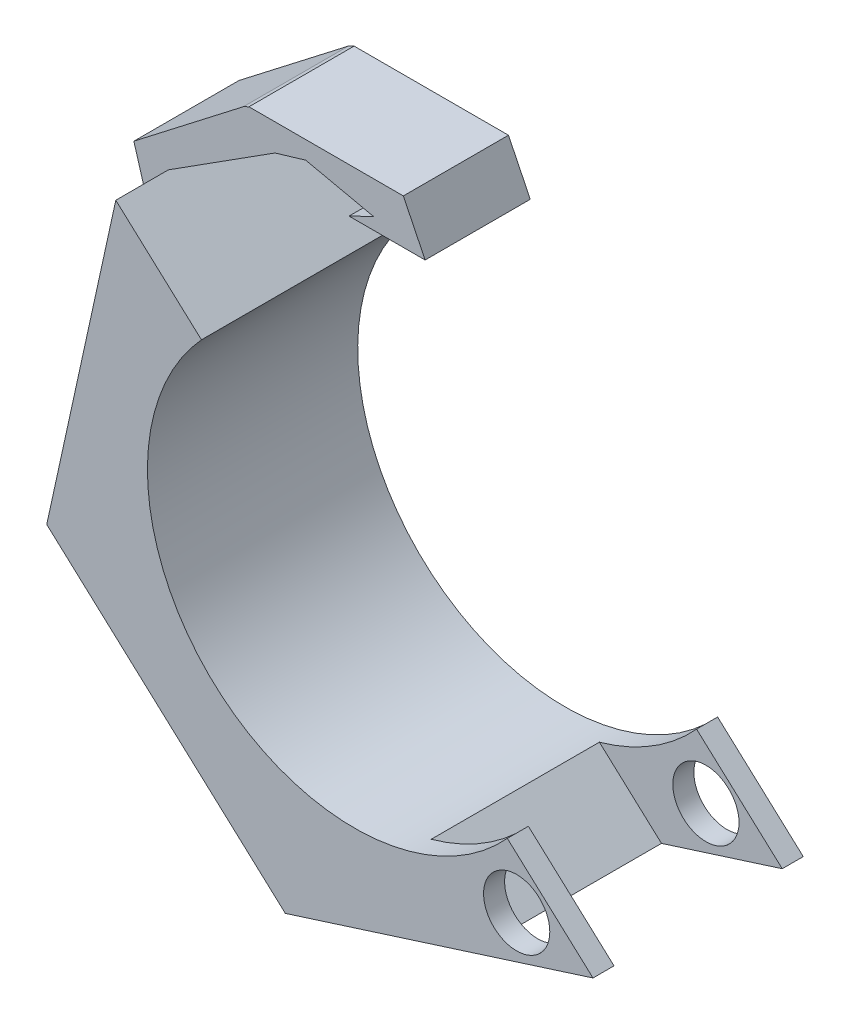
ISO-10303-21;
HEADER;
FILE_DESCRIPTION(('STEP AP214'),'2;1');
FILE_NAME('part.step','',(''),(''),'','','');
FILE_SCHEMA(('AUTOMOTIVE_DESIGN { 1 0 10303 214 1 1 1 1 }'));
ENDSEC;
DATA;
#1=APPLICATION_CONTEXT('core data for automotive mechanical design processes');
#2=APPLICATION_PROTOCOL_DEFINITION('international standard','automotive_design',2000,#1);
#3=PRODUCT_CONTEXT('',#1,'mechanical');
#4=PRODUCT('Part','Part','',(#3));
#5=PRODUCT_RELATED_PRODUCT_CATEGORY('part','',(#4));
#6=PRODUCT_DEFINITION_FORMATION('','',#4);
#7=PRODUCT_DEFINITION_CONTEXT('part definition',#1,'design');
#8=PRODUCT_DEFINITION('design','',#6,#7);
#9=PRODUCT_DEFINITION_SHAPE('','',#8);
#10=(LENGTH_UNIT() NAMED_UNIT(*) SI_UNIT(.MILLI.,.METRE.));
#11=(NAMED_UNIT(*) PLANE_ANGLE_UNIT() SI_UNIT($,.RADIAN.));
#12=(NAMED_UNIT(*) SI_UNIT($,.STERADIAN.) SOLID_ANGLE_UNIT());
#13=UNCERTAINTY_MEASURE_WITH_UNIT(LENGTH_MEASURE(1.E-05),#10,'distance_accuracy_value','');
#14=(GEOMETRIC_REPRESENTATION_CONTEXT(3) GLOBAL_UNCERTAINTY_ASSIGNED_CONTEXT((#13)) GLOBAL_UNIT_ASSIGNED_CONTEXT((#10,
#11,#12)) REPRESENTATION_CONTEXT('',''));
#15=CARTESIAN_POINT('',(0.,0.,0.));
#16=DIRECTION('',(0.,0.,1.));
#17=DIRECTION('',(1.,0.,0.));
#18=AXIS2_PLACEMENT_3D('',#15,#16,#17);
#19=CARTESIAN_POINT('',(-32.9932631854098,7.22458195180058,12.7));
#20=DIRECTION('',(0.976854840079001,-0.213903299213055,0.));
#21=DIRECTION('',(0.213903299213055,0.976854840079001,0.));
#22=AXIS2_PLACEMENT_3D('',#19,#20,#21);
#23=PLANE('',#22);
#24=DIRECTION('',(0.213903299213055,0.976854840079001,0.));
#25=VECTOR('',#24,1.);
#26=CARTESIAN_POINT('',(-28.8221488507552,26.2732513333411,6.35));
#27=LINE('',#26,#25);
#28=CARTESIAN_POINT('',(-30.477907748689,18.7117218973715,6.35));
#29=VERTEX_POINT('',#28);
#30=CARTESIAN_POINT('',(-28.8221488507552,26.2732513333411,6.35));
#31=VERTEX_POINT('',#30);
#32=EDGE_CURVE('E194',#29,#31,#27,.T.);
#33=ORIENTED_EDGE('',*,*,#32,.F.);
#34=DIRECTION('',(0.,0.,-1.));
#35=VECTOR('',#34,1.);
#36=CARTESIAN_POINT('',(-30.477907748689,18.7117218973715,6.35));
#37=LINE('',#36,#35);
#38=CARTESIAN_POINT('',(-30.477907748689,18.7117218973715,-6.35));
#39=VERTEX_POINT('',#38);
#40=EDGE_CURVE('E377',#29,#39,#37,.T.);
#41=ORIENTED_EDGE('',*,*,#40,.T.);
#42=DIRECTION('',(0.213903299213055,0.976854840079001,0.));
#43=VECTOR('',#42,1.);
#44=CARTESIAN_POINT('',(-28.8221488507552,26.2732513333411,-6.35));
#45=LINE('',#44,#43);
#46=CARTESIAN_POINT('',(-28.8221488507552,26.2732513333411,-6.35));
#47=VERTEX_POINT('',#46);
#48=EDGE_CURVE('E409',#39,#47,#45,.T.);
#49=ORIENTED_EDGE('',*,*,#48,.T.);
#50=DIRECTION('',(0.,0.,-1.));
#51=VECTOR('',#50,1.);
#52=CARTESIAN_POINT('',(-28.8221488507552,26.2732513333411,12.7));
#53=LINE('',#52,#51);
#54=CARTESIAN_POINT('',(-28.8221488507552,26.2732513333411,-12.7));
#55=VERTEX_POINT('',#54);
#56=EDGE_CURVE('E214',#47,#55,#53,.T.);
#57=ORIENTED_EDGE('',*,*,#56,.T.);
#58=DIRECTION('',(-0.213903299213055,-0.976854840079001,0.));
#59=VECTOR('',#58,1.);
#60=CARTESIAN_POINT('',(-32.9932631854098,7.22458195180058,-12.7));
#61=LINE('',#60,#59);
#62=CARTESIAN_POINT('',(-37.1643775200644,-11.8240874297399,-12.7));
#63=VERTEX_POINT('',#62);
#64=EDGE_CURVE('E281',#55,#63,#61,.T.);
#65=ORIENTED_EDGE('',*,*,#64,.T.);
#66=DIRECTION('',(0.,0.,-1.));
#67=VECTOR('',#66,1.);
#68=CARTESIAN_POINT('',(-37.1643775200644,-11.8240874297399,12.7));
#69=LINE('',#68,#67);
#70=CARTESIAN_POINT('',(-37.1643775200644,-11.8240874297399,12.7));
#71=VERTEX_POINT('',#70);
#72=EDGE_CURVE('E228',#71,#63,#69,.T.);
#73=ORIENTED_EDGE('',*,*,#72,.F.);
#74=DIRECTION('',(-0.213903299213055,-0.976854840079001,0.));
#75=VECTOR('',#74,1.);
#76=CARTESIAN_POINT('',(-32.9932631854098,7.22458195180058,12.7));
#77=LINE('',#76,#75);
#78=CARTESIAN_POINT('',(-28.8221488507552,26.2732513333411,12.7));
#79=VERTEX_POINT('',#78);
#80=EDGE_CURVE('E219',#79,#71,#77,.T.);
#81=ORIENTED_EDGE('',*,*,#80,.F.);
#82=EDGE_CURVE('E212',#79,#31,#53,.T.);
#83=ORIENTED_EDGE('',*,*,#82,.T.);
#84=EDGE_LOOP('',(#33,#41,#49,#57,#65,#73,#81,#83));
#85=FACE_BOUND('',#84,.T.);
#86=ADVANCED_FACE('F41',(#85),#23,.F.);
#87=CARTESIAN_POINT('',(0.,0.,12.7));
#88=DIRECTION('',(0.,0.,-1.));
#89=DIRECTION('',(-1.,0.,0.));
#90=AXIS2_PLACEMENT_3D('',#87,#88,#89);
#91=CYLINDRICAL_SURFACE('',#90,25.);
#92=DIRECTION('',(0.,0.,-1.));
#93=VECTOR('',#92,1.);
#94=CARTESIAN_POINT('',(6.73418511281736,-24.0759371752443,12.7));
#95=LINE('',#94,#93);
#96=CARTESIAN_POINT('',(6.73418511281735,-24.0759371752443,-10.16));
#97=VERTEX_POINT('',#96);
#98=CARTESIAN_POINT('',(6.73418511281735,-24.0759371752443,10.16));
#99=VERTEX_POINT('',#98);
#100=EDGE_CURVE('E295',#97,#99,#95,.F.);
#101=ORIENTED_EDGE('',*,*,#100,.F.);
#102=CARTESIAN_POINT('',(0.,0.,-10.16));
#103=DIRECTION('',(0.,0.,1.));
#104=DIRECTION('',(1.,0.,0.));
#105=AXIS2_PLACEMENT_3D('',#102,#103,#104);
#106=CIRCLE('',#105,25.);
#107=CARTESIAN_POINT('',(18.4757364427918,-16.8418277777828,-10.16));
#108=VERTEX_POINT('',#107);
#109=EDGE_CURVE('E313',#97,#108,#106,.T.);
#110=ORIENTED_EDGE('',*,*,#109,.T.);
#111=DIRECTION('',(0.,0.,-1.));
#112=VECTOR('',#111,1.);
#113=CARTESIAN_POINT('',(18.4757364427918,-16.8418277777828,12.7));
#114=LINE('',#113,#112);
#115=CARTESIAN_POINT('',(18.4757364427918,-16.8418277777828,-12.7));
#116=VERTEX_POINT('',#115);
#117=EDGE_CURVE('E243',#108,#116,#114,.T.);
#118=ORIENTED_EDGE('',*,*,#117,.T.);
#119=CARTESIAN_POINT('',(0.,0.,-12.7));
#120=DIRECTION('',(0.,0.,1.));
#121=DIRECTION('',(1.,0.,0.));
#122=AXIS2_PLACEMENT_3D('',#119,#120,#121);
#123=CIRCLE('',#122,25.);
#124=CARTESIAN_POINT('',(-18.4757364427918,16.8418277777828,-12.7));
#125=VERTEX_POINT('',#124);
#126=EDGE_CURVE('E292',#125,#116,#123,.T.);
#127=ORIENTED_EDGE('',*,*,#126,.F.);
#128=DIRECTION('',(0.,0.,-1.));
#129=VECTOR('',#128,1.);
#130=CARTESIAN_POINT('',(-18.4757364427918,16.8418277777828,12.7));
#131=LINE('',#130,#129);
#132=CARTESIAN_POINT('',(-18.4757364427918,16.8418277777828,12.7));
#133=VERTEX_POINT('',#132);
#134=EDGE_CURVE('E222',#133,#125,#131,.T.);
#135=ORIENTED_EDGE('',*,*,#134,.F.);
#136=CARTESIAN_POINT('',(0.,0.,12.7));
#137=DIRECTION('',(0.,0.,1.));
#138=DIRECTION('',(1.,0.,0.));
#139=AXIS2_PLACEMENT_3D('',#136,#137,#138);
#140=CIRCLE('',#139,25.);
#141=CARTESIAN_POINT('',(18.4757364427918,-16.8418277777828,12.7));
#142=VERTEX_POINT('',#141);
#143=EDGE_CURVE('E307',#133,#142,#140,.T.);
#144=ORIENTED_EDGE('',*,*,#143,.T.);
#145=CARTESIAN_POINT('',(18.4757364427918,-16.8418277777828,10.16));
#146=VERTEX_POINT('',#145);
#147=EDGE_CURVE('E256',#142,#146,#114,.T.);
#148=ORIENTED_EDGE('',*,*,#147,.T.);
#149=CARTESIAN_POINT('',(0.,0.,10.16));
#150=DIRECTION('',(0.,0.,1.));
#151=DIRECTION('',(1.,0.,0.));
#152=AXIS2_PLACEMENT_3D('',#149,#150,#151);
#153=CIRCLE('',#152,25.);
#154=EDGE_CURVE('E66',#99,#146,#153,.T.);
#155=ORIENTED_EDGE('',*,*,#154,.F.);
#156=EDGE_LOOP('',(#101,#110,#118,#127,#135,#144,#148,#155));
#157=FACE_BOUND('',#156,.T.);
#158=ADVANCED_FACE('F43',(#157),#91,.F.);
#159=CARTESIAN_POINT('',(10.239960090723,-32.1852950482111,12.7));
#160=DIRECTION('',(-0.303181728967691,0.952932756924727,0.));
#161=DIRECTION('',(-0.952932756924728,-0.303181728967691,0.));
#162=AXIS2_PLACEMENT_3D('',#159,#160,#161);
#163=PLANE('',#162);
#164=DIRECTION('',(0.952932756924728,0.303181728967691,0.));
#165=VECTOR('',#164,1.);
#166=CARTESIAN_POINT('',(10.239960090723,-32.1852950482111,-10.16));
#167=LINE('',#166,#165);
#168=CARTESIAN_POINT('',(14.2356770095116,-30.9140318293736,-10.16));
#169=VERTEX_POINT('',#168);
#170=CARTESIAN_POINT('',(28.8221488507552,-26.2732513333411,-10.16));
#171=VERTEX_POINT('',#170);
#172=EDGE_CURVE('E249',#169,#171,#167,.T.);
#173=ORIENTED_EDGE('',*,*,#172,.F.);
#174=DIRECTION('',(0.,0.,1.));
#175=VECTOR('',#174,1.);
#176=CARTESIAN_POINT('',(14.2356770095116,-30.9140318293736,12.7));
#177=LINE('',#176,#175);
#178=CARTESIAN_POINT('',(14.2356770095116,-30.9140318293736,10.16));
#179=VERTEX_POINT('',#178);
#180=EDGE_CURVE('E11',#169,#179,#177,.T.);
#181=ORIENTED_EDGE('',*,*,#180,.T.);
#182=DIRECTION('',(0.952932756924728,0.303181728967691,0.));
#183=VECTOR('',#182,1.);
#184=CARTESIAN_POINT('',(10.239960090723,-32.1852950482111,10.16));
#185=LINE('',#184,#183);
#186=CARTESIAN_POINT('',(28.8221488507552,-26.2732513333411,10.16));
#187=VERTEX_POINT('',#186);
#188=EDGE_CURVE('E320',#179,#187,#185,.T.);
#189=ORIENTED_EDGE('',*,*,#188,.T.);
#190=DIRECTION('',(0.,0.,-1.));
#191=VECTOR('',#190,1.);
#192=CARTESIAN_POINT('',(28.8221488507552,-26.2732513333411,12.7));
#193=LINE('',#192,#191);
#194=CARTESIAN_POINT('',(28.8221488507552,-26.2732513333411,12.7));
#195=VERTEX_POINT('',#194);
#196=EDGE_CURVE('E255',#195,#187,#193,.T.);
#197=ORIENTED_EDGE('',*,*,#196,.F.);
#198=DIRECTION('',(0.952932756924728,0.303181728967691,0.));
#199=VECTOR('',#198,1.);
#200=CARTESIAN_POINT('',(10.239960090723,-32.1852950482111,12.7));
#201=LINE('',#200,#199);
#202=CARTESIAN_POINT('',(-8.34222866930914,-38.097338763081,12.7));
#203=VERTEX_POINT('',#202);
#204=EDGE_CURVE('E296',#203,#195,#201,.T.);
#205=ORIENTED_EDGE('',*,*,#204,.F.);
#206=DIRECTION('',(0.,0.,-1.));
#207=VECTOR('',#206,1.);
#208=CARTESIAN_POINT('',(-8.34222866930914,-38.097338763081,12.7));
#209=LINE('',#208,#207);
#210=CARTESIAN_POINT('',(-8.34222866930914,-38.097338763081,-12.7));
#211=VERTEX_POINT('',#210);
#212=EDGE_CURVE('E261',#203,#211,#209,.T.);
#213=ORIENTED_EDGE('',*,*,#212,.T.);
#214=DIRECTION('',(0.952932756924728,0.303181728967691,0.));
#215=VECTOR('',#214,1.);
#216=CARTESIAN_POINT('',(10.239960090723,-32.1852950482111,-12.7));
#217=LINE('',#216,#215);
#218=CARTESIAN_POINT('',(28.8221488507552,-26.2732513333411,-12.7));
#219=VERTEX_POINT('',#218);
#220=EDGE_CURVE('E252',#211,#219,#217,.T.);
#221=ORIENTED_EDGE('',*,*,#220,.T.);
#222=EDGE_CURVE('E241',#171,#219,#193,.T.);
#223=ORIENTED_EDGE('',*,*,#222,.F.);
#224=EDGE_LOOP('',(#173,#181,#189,#197,#205,#213,#221,#223));
#225=FACE_BOUND('',#224,.T.);
#226=ADVANCED_FACE('F248',(#225),#163,.F.);
#227=CARTESIAN_POINT('',(0.,0.,12.7));
#228=DIRECTION('',(0.67367311111131,0.739029457711672,0.));
#229=DIRECTION('',(-0.739029457711672,0.67367311111131,0.));
#230=AXIS2_PLACEMENT_3D('',#227,#228,#229);
#231=PLANE('',#230);
#232=ORIENTED_EDGE('',*,*,#117,.F.);
#233=DIRECTION('',(0.739029457711672,-0.67367311111131,0.));
#234=VECTOR('',#233,1.);
#235=CARTESIAN_POINT('',(0.,0.,-10.16));
#236=LINE('',#235,#234);
#237=EDGE_CURVE('E51',#108,#171,#236,.T.);
#238=ORIENTED_EDGE('',*,*,#237,.T.);
#239=ORIENTED_EDGE('',*,*,#222,.T.);
#240=DIRECTION('',(0.739029457711672,-0.67367311111131,0.));
#241=VECTOR('',#240,1.);
#242=CARTESIAN_POINT('',(0.,0.,-12.7));
#243=LINE('',#242,#241);
#244=EDGE_CURVE('E286',#116,#219,#243,.T.);
#245=ORIENTED_EDGE('',*,*,#244,.F.);
#246=EDGE_LOOP('',(#232,#238,#239,#245));
#247=FACE_BOUND('',#246,.T.);
#248=ADVANCED_FACE('F239',(#247),#231,.T.);
#249=EDGE_CURVE('E287',#55,#125,#243,.T.);
#250=ORIENTED_EDGE('',*,*,#249,.F.);
#251=ORIENTED_EDGE('',*,*,#56,.F.);
#252=DIRECTION('',(0.,0.,-1.));
#253=VECTOR('',#252,1.);
#254=CARTESIAN_POINT('',(-28.8221488507552,26.2732513333411,6.35));
#255=LINE('',#254,#253);
#256=EDGE_CURVE('E58',#31,#47,#255,.T.);
#257=ORIENTED_EDGE('',*,*,#256,.F.);
#258=ORIENTED_EDGE('',*,*,#82,.F.);
#259=DIRECTION('',(0.739029457711672,-0.67367311111131,0.));
#260=VECTOR('',#259,1.);
#261=CARTESIAN_POINT('',(0.,0.,12.7));
#262=LINE('',#261,#260);
#263=EDGE_CURVE('E304',#79,#133,#262,.T.);
#264=ORIENTED_EDGE('',*,*,#263,.T.);
#265=ORIENTED_EDGE('',*,*,#134,.T.);
#266=EDGE_LOOP('',(#250,#251,#257,#258,#264,#265));
#267=FACE_BOUND('',#266,.T.);
#268=ADVANCED_FACE('F210',(#267),#231,.T.);
#269=CARTESIAN_POINT('',(-22.7533030946868,-24.9607130964105,12.7));
#270=DIRECTION('',(0.67367311111131,0.739029457711672,0.));
#271=DIRECTION('',(-0.739029457711672,0.67367311111131,0.));
#272=AXIS2_PLACEMENT_3D('',#269,#270,#271);
#273=PLANE('',#272);
#274=DIRECTION('',(0.739029457711672,-0.67367311111131,0.));
#275=VECTOR('',#274,1.);
#276=CARTESIAN_POINT('',(-22.7533030946868,-24.9607130964105,-12.7));
#277=LINE('',#276,#275);
#278=EDGE_CURVE('E274',#63,#211,#277,.T.);
#279=ORIENTED_EDGE('',*,*,#278,.T.);
#280=ORIENTED_EDGE('',*,*,#212,.F.);
#281=DIRECTION('',(0.739029457711672,-0.67367311111131,0.));
#282=VECTOR('',#281,1.);
#283=CARTESIAN_POINT('',(-22.7533030946868,-24.9607130964105,12.7));
#284=LINE('',#283,#282);
#285=EDGE_CURVE('E275',#71,#203,#284,.T.);
#286=ORIENTED_EDGE('',*,*,#285,.F.);
#287=ORIENTED_EDGE('',*,*,#72,.T.);
#288=EDGE_LOOP('',(#279,#280,#286,#287));
#289=FACE_BOUND('',#288,.T.);
#290=ADVANCED_FACE('F273',(#289),#273,.F.);
#291=DIRECTION('',(0.739029457711672,-0.67367311111131,0.));
#292=VECTOR('',#291,1.);
#293=CARTESIAN_POINT('',(0.,0.,10.16));
#294=LINE('',#293,#292);
#295=EDGE_CURVE('E226',#146,#187,#294,.T.);
#296=ORIENTED_EDGE('',*,*,#295,.F.);
#297=ORIENTED_EDGE('',*,*,#147,.F.);
#298=EDGE_CURVE('E299',#142,#195,#262,.T.);
#299=ORIENTED_EDGE('',*,*,#298,.T.);
#300=ORIENTED_EDGE('',*,*,#196,.T.);
#301=EDGE_LOOP('',(#296,#297,#299,#300));
#302=FACE_BOUND('',#301,.T.);
#303=ADVANCED_FACE('F499',(#302),#231,.T.);
#304=CARTESIAN_POINT('',(0.,0.,12.7));
#305=DIRECTION('',(0.,0.,1.));
#306=DIRECTION('',(1.,0.,0.));
#307=AXIS2_PLACEMENT_3D('',#304,#305,#306);
#308=PLANE('',#307);
#309=CARTESIAN_POINT('',(19.6038890384153,-24.0503898583383,12.7));
#310=DIRECTION('',(0.,0.,1.));
#311=DIRECTION('',(1.,0.,0.));
#312=AXIS2_PLACEMENT_3D('',#309,#310,#311);
#313=CIRCLE('',#312,4.);
#314=CARTESIAN_POINT('',(23.6038890384153,-24.0503898583383,12.7));
#315=VERTEX_POINT('',#314);
#316=EDGE_CURVE('E329',#315,#315,#313,.T.);
#317=ORIENTED_EDGE('',*,*,#316,.F.);
#318=EDGE_LOOP('',(#317));
#319=FACE_BOUND('',#318,.T.);
#320=ORIENTED_EDGE('',*,*,#143,.F.);
#321=ORIENTED_EDGE('',*,*,#263,.F.);
#322=ORIENTED_EDGE('',*,*,#80,.T.);
#323=ORIENTED_EDGE('',*,*,#285,.T.);
#324=ORIENTED_EDGE('',*,*,#204,.T.);
#325=ORIENTED_EDGE('',*,*,#298,.F.);
#326=EDGE_LOOP('',(#320,#321,#322,#323,#324,#325));
#327=FACE_BOUND('',#326,.T.);
#328=ADVANCED_FACE('F504',(#319,#327),#308,.T.);
#329=CARTESIAN_POINT('',(0.,0.,-12.7));
#330=DIRECTION('',(0.,0.,1.));
#331=DIRECTION('',(1.,0.,0.));
#332=AXIS2_PLACEMENT_3D('',#329,#330,#331);
#333=PLANE('',#332);
#334=CARTESIAN_POINT('',(19.6038890384153,-24.0503898583383,-12.7));
#335=DIRECTION('',(0.,0.,1.));
#336=DIRECTION('',(1.,0.,0.));
#337=AXIS2_PLACEMENT_3D('',#334,#335,#336);
#338=CIRCLE('',#337,4.);
#339=CARTESIAN_POINT('',(23.6038890384153,-24.0503898583383,-12.7));
#340=VERTEX_POINT('',#339);
#341=EDGE_CURVE('E216',#340,#340,#338,.T.);
#342=ORIENTED_EDGE('',*,*,#341,.T.);
#343=EDGE_LOOP('',(#342));
#344=FACE_BOUND('',#343,.T.);
#345=ORIENTED_EDGE('',*,*,#126,.T.);
#346=ORIENTED_EDGE('',*,*,#244,.T.);
#347=ORIENTED_EDGE('',*,*,#220,.F.);
#348=ORIENTED_EDGE('',*,*,#278,.F.);
#349=ORIENTED_EDGE('',*,*,#64,.F.);
#350=ORIENTED_EDGE('',*,*,#249,.T.);
#351=EDGE_LOOP('',(#345,#346,#347,#348,#349,#350));
#352=FACE_BOUND('',#351,.T.);
#353=ADVANCED_FACE('F279',(#344,#352),#333,.F.);
#354=CARTESIAN_POINT('',(3.04575912038011,-20.7136985154716,-10.16));
#355=DIRECTION('',(-0.67367311111131,-0.739029457711672,0.));
#356=DIRECTION('',(0.739029457711673,-0.67367311111131,0.));
#357=AXIS2_PLACEMENT_3D('',#354,#355,#356);
#358=PLANE('',#357);
#359=ORIENTED_EDGE('',*,*,#100,.T.);
#360=DIRECTION('',(0.739029457711673,-0.67367311111131,0.));
#361=VECTOR('',#360,1.);
#362=CARTESIAN_POINT('',(3.04575912038011,-20.7136985154716,10.16));
#363=LINE('',#362,#361);
#364=EDGE_CURVE('E325',#99,#179,#363,.T.);
#365=ORIENTED_EDGE('',*,*,#364,.T.);
#366=ORIENTED_EDGE('',*,*,#180,.F.);
#367=DIRECTION('',(0.739029457711673,-0.67367311111131,0.));
#368=VECTOR('',#367,1.);
#369=CARTESIAN_POINT('',(3.04575912038011,-20.7136985154716,-10.16));
#370=LINE('',#369,#368);
#371=EDGE_CURVE('E324',#97,#169,#370,.T.);
#372=ORIENTED_EDGE('',*,*,#371,.F.);
#373=EDGE_LOOP('',(#359,#365,#366,#372));
#374=FACE_BOUND('',#373,.T.);
#375=ADVANCED_FACE('F508',(#374),#358,.F.);
#376=CARTESIAN_POINT('',(0.,0.,-10.16));
#377=DIRECTION('',(0.,0.,1.));
#378=DIRECTION('',(1.,0.,0.));
#379=AXIS2_PLACEMENT_3D('',#376,#377,#378);
#380=PLANE('',#379);
#381=CARTESIAN_POINT('',(19.6038890384153,-24.0503898583383,-10.16));
#382=DIRECTION('',(0.,0.,1.));
#383=DIRECTION('',(1.,0.,0.));
#384=AXIS2_PLACEMENT_3D('',#381,#382,#383);
#385=CIRCLE('',#384,4.);
#386=CARTESIAN_POINT('',(23.6038890384153,-24.0503898583383,-10.16));
#387=VERTEX_POINT('',#386);
#388=EDGE_CURVE('E336',#387,#387,#385,.T.);
#389=ORIENTED_EDGE('',*,*,#388,.F.);
#390=EDGE_LOOP('',(#389));
#391=FACE_BOUND('',#390,.T.);
#392=ORIENTED_EDGE('',*,*,#371,.T.);
#393=ORIENTED_EDGE('',*,*,#172,.T.);
#394=ORIENTED_EDGE('',*,*,#237,.F.);
#395=ORIENTED_EDGE('',*,*,#109,.F.);
#396=EDGE_LOOP('',(#392,#393,#394,#395));
#397=FACE_BOUND('',#396,.T.);
#398=ADVANCED_FACE('F515',(#391,#397),#380,.T.);
#399=CARTESIAN_POINT('',(0.,0.,10.16));
#400=DIRECTION('',(0.,0.,1.));
#401=DIRECTION('',(1.,0.,0.));
#402=AXIS2_PLACEMENT_3D('',#399,#400,#401);
#403=PLANE('',#402);
#404=CARTESIAN_POINT('',(19.6038890384153,-24.0503898583383,10.16));
#405=DIRECTION('',(0.,0.,1.));
#406=DIRECTION('',(1.,0.,0.));
#407=AXIS2_PLACEMENT_3D('',#404,#405,#406);
#408=CIRCLE('',#407,4.);
#409=CARTESIAN_POINT('',(23.6038890384153,-24.0503898583383,10.16));
#410=VERTEX_POINT('',#409);
#411=EDGE_CURVE('E45',#410,#410,#408,.T.);
#412=ORIENTED_EDGE('',*,*,#411,.T.);
#413=EDGE_LOOP('',(#412));
#414=FACE_BOUND('',#413,.T.);
#415=ORIENTED_EDGE('',*,*,#154,.T.);
#416=ORIENTED_EDGE('',*,*,#295,.T.);
#417=ORIENTED_EDGE('',*,*,#188,.F.);
#418=ORIENTED_EDGE('',*,*,#364,.F.);
#419=EDGE_LOOP('',(#415,#416,#417,#418));
#420=FACE_BOUND('',#419,.T.);
#421=ADVANCED_FACE('F517',(#414,#420),#403,.F.);
#422=CARTESIAN_POINT('',(19.6038890384153,-24.0503898583383,-12.7));
#423=DIRECTION('',(0.,0.,1.));
#424=DIRECTION('',(1.,0.,0.));
#425=AXIS2_PLACEMENT_3D('',#422,#423,#424);
#426=CYLINDRICAL_SURFACE('',#425,4.);
#427=ORIENTED_EDGE('',*,*,#316,.T.);
#428=EDGE_LOOP('',(#427));
#429=FACE_BOUND('',#428,.T.);
#430=ORIENTED_EDGE('',*,*,#411,.F.);
#431=EDGE_LOOP('',(#430));
#432=FACE_BOUND('',#431,.T.);
#433=ADVANCED_FACE('F520',(#429,#432),#426,.F.);
#434=ORIENTED_EDGE('',*,*,#388,.T.);
#435=EDGE_LOOP('',(#434));
#436=FACE_BOUND('',#435,.T.);
#437=ORIENTED_EDGE('',*,*,#341,.F.);
#438=EDGE_LOOP('',(#437));
#439=FACE_BOUND('',#438,.T.);
#440=ADVANCED_FACE('F525',(#436,#439),#426,.F.);
#441=CARTESIAN_POINT('',(-15.939758745351,34.4796025646336,6.35));
#442=DIRECTION('',(-0.537269971561568,0.843410325795358,0.));
#443=DIRECTION('',(-0.843410325795358,-0.537269971561569,0.));
#444=AXIS2_PLACEMENT_3D('',#441,#442,#443);
#445=PLANE('',#444);
#446=DIRECTION('',(0.843410325795358,0.537269971561568,0.));
#447=VECTOR('',#446,1.);
#448=CARTESIAN_POINT('',(-15.939758745351,34.4796025646336,-6.35));
#449=LINE('',#448,#447);
#450=CARTESIAN_POINT('',(-15.939758745351,34.4796025646336,-6.35));
#451=VERTEX_POINT('',#450);
#452=EDGE_CURVE('E406',#47,#451,#449,.T.);
#453=ORIENTED_EDGE('',*,*,#452,.T.);
#454=DIRECTION('',(0.,0.,-1.));
#455=VECTOR('',#454,1.);
#456=CARTESIAN_POINT('',(-15.939758745351,34.4796025646336,6.35));
#457=LINE('',#456,#455);
#458=CARTESIAN_POINT('',(-15.939758745351,34.4796025646336,6.35));
#459=VERTEX_POINT('',#458);
#460=EDGE_CURVE('E189',#459,#451,#457,.T.);
#461=ORIENTED_EDGE('',*,*,#460,.F.);
#462=DIRECTION('',(0.843410325795358,0.537269971561568,0.));
#463=VECTOR('',#462,1.);
#464=CARTESIAN_POINT('',(-15.939758745351,34.4796025646336,6.35));
#465=LINE('',#464,#463);
#466=EDGE_CURVE('E185',#31,#459,#465,.T.);
#467=ORIENTED_EDGE('',*,*,#466,.F.);
#468=ORIENTED_EDGE('',*,*,#256,.T.);
#469=EDGE_LOOP('',(#453,#461,#467,#468));
#470=FACE_BOUND('',#469,.T.);
#471=ADVANCED_FACE('F187',(#470),#445,.F.);
#472=CARTESIAN_POINT('',(-12.2294811660783,35.5808172305482,6.35));
#473=DIRECTION('',(-0.284533227822432,0.958666178742605,0.));
#474=DIRECTION('',(-0.958666178742605,-0.284533227822432,0.));
#475=AXIS2_PLACEMENT_3D('',#472,#473,#474);
#476=PLANE('',#475);
#477=DIRECTION('',(0.958666178742605,0.284533227822432,0.));
#478=VECTOR('',#477,1.);
#479=CARTESIAN_POINT('',(-12.2294811660783,35.5808172305482,-6.35));
#480=LINE('',#479,#478);
#481=CARTESIAN_POINT('',(-12.2294811660783,35.5808172305482,-6.35));
#482=VERTEX_POINT('',#481);
#483=EDGE_CURVE('E403',#451,#482,#480,.T.);
#484=ORIENTED_EDGE('',*,*,#483,.T.);
#485=DIRECTION('',(0.,0.,-1.));
#486=VECTOR('',#485,1.);
#487=CARTESIAN_POINT('',(-12.2294811660783,35.5808172305482,6.35));
#488=LINE('',#487,#486);
#489=CARTESIAN_POINT('',(-12.2294811660783,35.5808172305482,6.35));
#490=VERTEX_POINT('',#489);
#491=EDGE_CURVE('E345',#490,#482,#488,.T.);
#492=ORIENTED_EDGE('',*,*,#491,.F.);
#493=DIRECTION('',(0.958666178742605,0.284533227822432,0.));
#494=VECTOR('',#493,1.);
#495=CARTESIAN_POINT('',(-12.2294811660783,35.5808172305482,6.35));
#496=LINE('',#495,#494);
#497=EDGE_CURVE('E193',#459,#490,#496,.T.);
#498=ORIENTED_EDGE('',*,*,#497,.F.);
#499=ORIENTED_EDGE('',*,*,#460,.T.);
#500=EDGE_LOOP('',(#484,#492,#498,#499));
#501=FACE_BOUND('',#500,.T.);
#502=ADVANCED_FACE('F441',(#501),#476,.F.);
#503=CARTESIAN_POINT('',(-4.04607273511508,33.7888846010806,6.35));
#504=DIRECTION('',(0.213903299213055,0.976854840079001,0.));
#505=DIRECTION('',(-0.976854840079001,0.213903299213055,0.));
#506=AXIS2_PLACEMENT_3D('',#503,#504,#505);
#507=PLANE('',#506);
#508=DIRECTION('',(0.976854840079001,-0.213903299213055,0.));
#509=VECTOR('',#508,1.);
#510=CARTESIAN_POINT('',(-4.04607273511508,33.7888846010806,-6.35));
#511=LINE('',#510,#509);
#512=CARTESIAN_POINT('',(-4.04607273511508,33.7888846010806,-6.35));
#513=VERTEX_POINT('',#512);
#514=EDGE_CURVE('E400',#482,#513,#511,.T.);
#515=ORIENTED_EDGE('',*,*,#514,.T.);
#516=DIRECTION('',(0.,0.,-1.));
#517=VECTOR('',#516,1.);
#518=CARTESIAN_POINT('',(-4.04607273511508,33.7888846010806,6.35));
#519=LINE('',#518,#517);
#520=CARTESIAN_POINT('',(-4.04607273511508,33.7888846010806,6.35));
#521=VERTEX_POINT('',#520);
#522=EDGE_CURVE('E349',#521,#513,#519,.T.);
#523=ORIENTED_EDGE('',*,*,#522,.F.);
#524=DIRECTION('',(0.976854840079001,-0.213903299213055,0.));
#525=VECTOR('',#524,1.);
#526=CARTESIAN_POINT('',(-4.04607273511508,33.7888846010806,6.35));
#527=LINE('',#526,#525);
#528=EDGE_CURVE('E433',#490,#521,#527,.T.);
#529=ORIENTED_EDGE('',*,*,#528,.F.);
#530=ORIENTED_EDGE('',*,*,#491,.T.);
#531=EDGE_LOOP('',(#515,#523,#529,#530));
#532=FACE_BOUND('',#531,.T.);
#533=ADVANCED_FACE('F445',(#532),#507,.F.);
#534=CARTESIAN_POINT('',(-6.9965582677952,32.3479498060507,6.35));
#535=DIRECTION('',(0.438835298505001,-0.898567515986432,0.));
#536=DIRECTION('',(0.898567515986432,0.438835298505001,0.));
#537=AXIS2_PLACEMENT_3D('',#534,#535,#536);
#538=PLANE('',#537);
#539=DIRECTION('',(-0.898567515986432,-0.438835298505001,0.));
#540=VECTOR('',#539,1.);
#541=CARTESIAN_POINT('',(-6.9965582677952,32.3479498060507,-6.35));
#542=LINE('',#541,#540);
#543=CARTESIAN_POINT('',(-6.9965582677952,32.3479498060507,-6.35));
#544=VERTEX_POINT('',#543);
#545=EDGE_CURVE('E397',#513,#544,#542,.T.);
#546=ORIENTED_EDGE('',*,*,#545,.T.);
#547=DIRECTION('',(0.,0.,-1.));
#548=VECTOR('',#547,1.);
#549=CARTESIAN_POINT('',(-6.9965582677952,32.3479498060507,6.35));
#550=LINE('',#549,#548);
#551=CARTESIAN_POINT('',(-6.9965582677952,32.3479498060507,6.35));
#552=VERTEX_POINT('',#551);
#553=EDGE_CURVE('E353',#552,#544,#550,.T.);
#554=ORIENTED_EDGE('',*,*,#553,.F.);
#555=DIRECTION('',(-0.898567515986432,-0.438835298505001,0.));
#556=VECTOR('',#555,1.);
#557=CARTESIAN_POINT('',(-6.9965582677952,32.3479498060507,6.35));
#558=LINE('',#557,#556);
#559=EDGE_CURVE('E430',#521,#552,#558,.T.);
#560=ORIENTED_EDGE('',*,*,#559,.F.);
#561=ORIENTED_EDGE('',*,*,#522,.T.);
#562=EDGE_LOOP('',(#546,#554,#560,#561));
#563=FACE_BOUND('',#562,.T.);
#564=ADVANCED_FACE('F450',(#563),#538,.F.);
#565=CARTESIAN_POINT('',(2.19513321285716,32.3479498060507,6.35));
#566=DIRECTION('',(0.,1.,0.));
#567=DIRECTION('',(-1.,0.,0.));
#568=AXIS2_PLACEMENT_3D('',#565,#566,#567);
#569=PLANE('',#568);
#570=DIRECTION('',(1.,0.,0.));
#571=VECTOR('',#570,1.);
#572=CARTESIAN_POINT('',(2.19513321285716,32.3479498060507,-6.35));
#573=LINE('',#572,#571);
#574=CARTESIAN_POINT('',(2.19513321285716,32.3479498060507,-6.35));
#575=VERTEX_POINT('',#574);
#576=EDGE_CURVE('E394',#544,#575,#573,.T.);
#577=ORIENTED_EDGE('',*,*,#576,.T.);
#578=DIRECTION('',(0.,0.,-1.));
#579=VECTOR('',#578,1.);
#580=CARTESIAN_POINT('',(2.19513321285716,32.3479498060507,6.35));
#581=LINE('',#580,#579);
#582=CARTESIAN_POINT('',(2.19513321285716,32.3479498060507,6.35));
#583=VERTEX_POINT('',#582);
#584=EDGE_CURVE('E357',#583,#575,#581,.T.);
#585=ORIENTED_EDGE('',*,*,#584,.F.);
#586=DIRECTION('',(1.,0.,0.));
#587=VECTOR('',#586,1.);
#588=CARTESIAN_POINT('',(2.19513321285716,32.3479498060507,6.35));
#589=LINE('',#588,#587);
#590=EDGE_CURVE('E427',#552,#583,#589,.T.);
#591=ORIENTED_EDGE('',*,*,#590,.F.);
#592=ORIENTED_EDGE('',*,*,#553,.T.);
#593=EDGE_LOOP('',(#577,#585,#591,#592));
#594=FACE_BOUND('',#593,.T.);
#595=ADVANCED_FACE('F456',(#594),#569,.F.);
#596=CARTESIAN_POINT('',(-0.437878578172849,37.7393549019693,6.35));
#597=DIRECTION('',(-0.898567515986432,-0.438835298505002,0.));
#598=DIRECTION('',(0.438835298505002,-0.898567515986432,0.));
#599=AXIS2_PLACEMENT_3D('',#596,#597,#598);
#600=PLANE('',#599);
#601=DIRECTION('',(-0.438835298505002,0.898567515986432,0.));
#602=VECTOR('',#601,1.);
#603=CARTESIAN_POINT('',(-0.437878578172849,37.7393549019693,-6.35));
#604=LINE('',#603,#602);
#605=CARTESIAN_POINT('',(-0.437878578172849,37.7393549019693,-6.35));
#606=VERTEX_POINT('',#605);
#607=EDGE_CURVE('E391',#575,#606,#604,.T.);
#608=ORIENTED_EDGE('',*,*,#607,.T.);
#609=DIRECTION('',(0.,0.,-1.));
#610=VECTOR('',#609,1.);
#611=CARTESIAN_POINT('',(-0.437878578172849,37.7393549019693,6.35));
#612=LINE('',#611,#610);
#613=CARTESIAN_POINT('',(-0.437878578172849,37.7393549019693,6.35));
#614=VERTEX_POINT('',#613);
#615=EDGE_CURVE('E361',#614,#606,#612,.T.);
#616=ORIENTED_EDGE('',*,*,#615,.F.);
#617=DIRECTION('',(-0.438835298505002,0.898567515986432,0.));
#618=VECTOR('',#617,1.);
#619=CARTESIAN_POINT('',(-0.437878578172849,37.7393549019693,6.35));
#620=LINE('',#619,#618);
#621=EDGE_CURVE('E424',#583,#614,#620,.T.);
#622=ORIENTED_EDGE('',*,*,#621,.F.);
#623=ORIENTED_EDGE('',*,*,#584,.T.);
#624=EDGE_LOOP('',(#608,#616,#622,#623));
#625=FACE_BOUND('',#624,.T.);
#626=ADVANCED_FACE('F460',(#625),#600,.F.);
#627=CARTESIAN_POINT('',(-19.0863233133488,37.7393549019693,6.35));
#628=DIRECTION('',(0.,-1.,0.));
#629=DIRECTION('',(0.,0.,-1.));
#630=AXIS2_PLACEMENT_3D('',#627,#628,#629);
#631=PLANE('',#630);
#632=DIRECTION('',(-1.,0.,0.));
#633=VECTOR('',#632,1.);
#634=CARTESIAN_POINT('',(-19.0863233133488,37.7393549019693,-6.35));
#635=LINE('',#634,#633);
#636=CARTESIAN_POINT('',(-19.0863233133488,37.7393549019693,-6.35));
#637=VERTEX_POINT('',#636);
#638=EDGE_CURVE('E388',#606,#637,#635,.T.);
#639=ORIENTED_EDGE('',*,*,#638,.T.);
#640=DIRECTION('',(0.,0.,-1.));
#641=VECTOR('',#640,1.);
#642=CARTESIAN_POINT('',(-19.0863233133488,37.7393549019693,6.35));
#643=LINE('',#642,#641);
#644=CARTESIAN_POINT('',(-19.0863233133488,37.7393549019693,6.35));
#645=VERTEX_POINT('',#644);
#646=EDGE_CURVE('E365',#645,#637,#643,.T.);
#647=ORIENTED_EDGE('',*,*,#646,.F.);
#648=DIRECTION('',(-1.,0.,0.));
#649=VECTOR('',#648,1.);
#650=CARTESIAN_POINT('',(-19.0863233133488,37.7393549019693,6.35));
#651=LINE('',#650,#649);
#652=EDGE_CURVE('E421',#614,#645,#651,.T.);
#653=ORIENTED_EDGE('',*,*,#652,.F.);
#654=ORIENTED_EDGE('',*,*,#615,.T.);
#655=EDGE_LOOP('',(#639,#647,#653,#654));
#656=FACE_BOUND('',#655,.T.);
#657=ADVANCED_FACE('F465',(#656),#631,.F.);
#658=CARTESIAN_POINT('',(-19.7567290528903,37.4119474477746,6.35));
#659=DIRECTION('',(0.438835298505001,-0.898567515986432,0.));
#660=DIRECTION('',(0.898567515986432,0.438835298505001,0.));
#661=AXIS2_PLACEMENT_3D('',#658,#659,#660);
#662=PLANE('',#661);
#663=DIRECTION('',(-0.898567515986432,-0.438835298505001,0.));
#664=VECTOR('',#663,1.);
#665=CARTESIAN_POINT('',(-19.7567290528903,37.4119474477746,-6.35));
#666=LINE('',#665,#664);
#667=CARTESIAN_POINT('',(-19.7567290528903,37.4119474477746,-6.35));
#668=VERTEX_POINT('',#667);
#669=EDGE_CURVE('E385',#637,#668,#666,.T.);
#670=ORIENTED_EDGE('',*,*,#669,.T.);
#671=DIRECTION('',(0.,0.,-1.));
#672=VECTOR('',#671,1.);
#673=CARTESIAN_POINT('',(-19.7567290528903,37.4119474477746,6.35));
#674=LINE('',#673,#672);
#675=CARTESIAN_POINT('',(-19.7567290528903,37.4119474477746,6.35));
#676=VERTEX_POINT('',#675);
#677=EDGE_CURVE('E369',#676,#668,#674,.T.);
#678=ORIENTED_EDGE('',*,*,#677,.F.);
#679=DIRECTION('',(-0.898567515986432,-0.438835298505001,0.));
#680=VECTOR('',#679,1.);
#681=CARTESIAN_POINT('',(-19.7567290528903,37.4119474477746,6.35));
#682=LINE('',#681,#680);
#683=EDGE_CURVE('E418',#645,#676,#682,.T.);
#684=ORIENTED_EDGE('',*,*,#683,.F.);
#685=ORIENTED_EDGE('',*,*,#646,.T.);
#686=EDGE_LOOP('',(#670,#678,#684,#685));
#687=FACE_BOUND('',#686,.T.);
#688=ADVANCED_FACE('F471',(#687),#662,.F.);
#689=CARTESIAN_POINT('',(-32.9932631854098,27.1866061952624,6.35));
#690=DIRECTION('',(0.611339322493486,-0.791368582124162,0.));
#691=DIRECTION('',(0.791368582124162,0.611339322493486,0.));
#692=AXIS2_PLACEMENT_3D('',#689,#690,#691);
#693=PLANE('',#692);
#694=DIRECTION('',(-0.791368582124162,-0.611339322493486,0.));
#695=VECTOR('',#694,1.);
#696=CARTESIAN_POINT('',(-32.9932631854098,27.1866061952624,-6.35));
#697=LINE('',#696,#695);
#698=CARTESIAN_POINT('',(-32.9932631854098,27.1866061952624,-6.35));
#699=VERTEX_POINT('',#698);
#700=EDGE_CURVE('E382',#668,#699,#697,.T.);
#701=ORIENTED_EDGE('',*,*,#700,.T.);
#702=DIRECTION('',(0.,0.,-1.));
#703=VECTOR('',#702,1.);
#704=CARTESIAN_POINT('',(-32.9932631854098,27.1866061952624,6.35));
#705=LINE('',#704,#703);
#706=CARTESIAN_POINT('',(-32.9932631854098,27.1866061952624,6.35));
#707=VERTEX_POINT('',#706);
#708=EDGE_CURVE('E373',#707,#699,#705,.T.);
#709=ORIENTED_EDGE('',*,*,#708,.F.);
#710=DIRECTION('',(-0.791368582124162,-0.611339322493486,0.));
#711=VECTOR('',#710,1.);
#712=CARTESIAN_POINT('',(-32.9932631854098,27.1866061952624,6.35));
#713=LINE('',#712,#711);
#714=EDGE_CURVE('E415',#676,#707,#713,.T.);
#715=ORIENTED_EDGE('',*,*,#714,.F.);
#716=ORIENTED_EDGE('',*,*,#677,.T.);
#717=EDGE_LOOP('',(#701,#709,#715,#716));
#718=FACE_BOUND('',#717,.T.);
#719=ADVANCED_FACE('F475',(#718),#693,.F.);
#720=CARTESIAN_POINT('',(-30.477907748689,18.7117218973715,6.35));
#721=DIRECTION('',(0.958666178742605,0.284533227822431,0.));
#722=DIRECTION('',(-0.284533227822431,0.958666178742605,0.));
#723=AXIS2_PLACEMENT_3D('',#720,#721,#722);
#724=PLANE('',#723);
#725=DIRECTION('',(0.284533227822431,-0.958666178742605,0.));
#726=VECTOR('',#725,1.);
#727=CARTESIAN_POINT('',(-30.477907748689,18.7117218973715,-6.35));
#728=LINE('',#727,#726);
#729=EDGE_CURVE('E205',#699,#39,#728,.T.);
#730=ORIENTED_EDGE('',*,*,#729,.T.);
#731=ORIENTED_EDGE('',*,*,#40,.F.);
#732=DIRECTION('',(0.284533227822431,-0.958666178742605,0.));
#733=VECTOR('',#732,1.);
#734=CARTESIAN_POINT('',(-30.477907748689,18.7117218973715,6.35));
#735=LINE('',#734,#733);
#736=EDGE_CURVE('E199',#707,#29,#735,.T.);
#737=ORIENTED_EDGE('',*,*,#736,.F.);
#738=ORIENTED_EDGE('',*,*,#708,.T.);
#739=EDGE_LOOP('',(#730,#731,#737,#738));
#740=FACE_BOUND('',#739,.T.);
#741=ADVANCED_FACE('F478',(#740),#724,.F.);
#742=CARTESIAN_POINT('',(0.,0.,6.35));
#743=DIRECTION('',(0.,0.,-1.));
#744=DIRECTION('',(-1.,0.,0.));
#745=AXIS2_PLACEMENT_3D('',#742,#743,#744);
#746=PLANE('',#745);
#747=ORIENTED_EDGE('',*,*,#32,.T.);
#748=ORIENTED_EDGE('',*,*,#466,.T.);
#749=ORIENTED_EDGE('',*,*,#497,.T.);
#750=ORIENTED_EDGE('',*,*,#528,.T.);
#751=ORIENTED_EDGE('',*,*,#559,.T.);
#752=ORIENTED_EDGE('',*,*,#590,.T.);
#753=ORIENTED_EDGE('',*,*,#621,.T.);
#754=ORIENTED_EDGE('',*,*,#652,.T.);
#755=ORIENTED_EDGE('',*,*,#683,.T.);
#756=ORIENTED_EDGE('',*,*,#714,.T.);
#757=ORIENTED_EDGE('',*,*,#736,.T.);
#758=EDGE_LOOP('',(#747,#748,#749,#750,#751,#752,#753,#754,#755,#756,#757));
#759=FACE_BOUND('',#758,.T.);
#760=ADVANCED_FACE('F197',(#759),#746,.F.);
#761=CARTESIAN_POINT('',(0.,0.,-6.35));
#762=DIRECTION('',(0.,0.,-1.));
#763=DIRECTION('',(-1.,0.,0.));
#764=AXIS2_PLACEMENT_3D('',#761,#762,#763);
#765=PLANE('',#764);
#766=ORIENTED_EDGE('',*,*,#48,.F.);
#767=ORIENTED_EDGE('',*,*,#729,.F.);
#768=ORIENTED_EDGE('',*,*,#700,.F.);
#769=ORIENTED_EDGE('',*,*,#669,.F.);
#770=ORIENTED_EDGE('',*,*,#638,.F.);
#771=ORIENTED_EDGE('',*,*,#607,.F.);
#772=ORIENTED_EDGE('',*,*,#576,.F.);
#773=ORIENTED_EDGE('',*,*,#545,.F.);
#774=ORIENTED_EDGE('',*,*,#514,.F.);
#775=ORIENTED_EDGE('',*,*,#483,.F.);
#776=ORIENTED_EDGE('',*,*,#452,.F.);
#777=EDGE_LOOP('',(#766,#767,#768,#769,#770,#771,#772,#773,#774,#775,#776));
#778=FACE_BOUND('',#777,.T.);
#779=ADVANCED_FACE('F481',(#778),#765,.T.);
#780=CLOSED_SHELL('',(#86,#158,#226,#248,#268,#290,#303,#328,#353,#375,#398,#421,#433,#440,#471,
#502,#533,#564,#595,#626,#657,#688,#719,#741,#760,#779));
#781=MANIFOLD_SOLID_BREP('B2',#780);
#782=ADVANCED_BREP_SHAPE_REPRESENTATION('',(#18,#781),#14);
#783=SHAPE_DEFINITION_REPRESENTATION(#9,#782);
ENDSEC;
END-ISO-10303-21;
